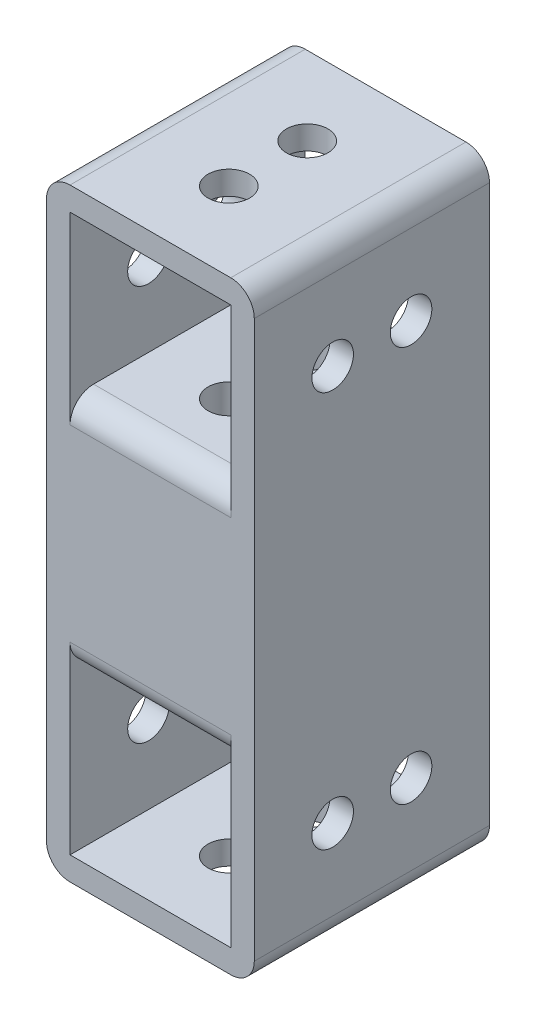
ISO-10303-21;
HEADER;
FILE_DESCRIPTION(('STEP AP214'),'2;1');
FILE_NAME('part.step','',(''),(''),'','','');
FILE_SCHEMA(('AUTOMOTIVE_DESIGN { 1 0 10303 214 1 1 1 1 }'));
ENDSEC;
DATA;
#1=APPLICATION_CONTEXT('core data for automotive mechanical design processes');
#2=APPLICATION_PROTOCOL_DEFINITION('international standard','automotive_design',2000,#1);
#3=PRODUCT_CONTEXT('',#1,'mechanical');
#4=PRODUCT('Part','Part','',(#3));
#5=PRODUCT_RELATED_PRODUCT_CATEGORY('part','',(#4));
#6=PRODUCT_DEFINITION_FORMATION('','',#4);
#7=PRODUCT_DEFINITION_CONTEXT('part definition',#1,'design');
#8=PRODUCT_DEFINITION('design','',#6,#7);
#9=PRODUCT_DEFINITION_SHAPE('','',#8);
#10=(LENGTH_UNIT() NAMED_UNIT(*) SI_UNIT(.MILLI.,.METRE.));
#11=(NAMED_UNIT(*) PLANE_ANGLE_UNIT() SI_UNIT($,.RADIAN.));
#12=(NAMED_UNIT(*) SI_UNIT($,.STERADIAN.) SOLID_ANGLE_UNIT());
#13=UNCERTAINTY_MEASURE_WITH_UNIT(LENGTH_MEASURE(1.E-05),#10,'distance_accuracy_value','');
#14=(GEOMETRIC_REPRESENTATION_CONTEXT(3) GLOBAL_UNCERTAINTY_ASSIGNED_CONTEXT((#13)) GLOBAL_UNIT_ASSIGNED_CONTEXT((#10,
#11,#12)) REPRESENTATION_CONTEXT('',''));
#15=CARTESIAN_POINT('',(0.,0.,0.));
#16=DIRECTION('',(0.,0.,1.));
#17=DIRECTION('',(1.,0.,0.));
#18=AXIS2_PLACEMENT_3D('',#15,#16,#17);
#19=CARTESIAN_POINT('',(-13.25,0.,30.));
#20=DIRECTION('',(-1.,0.,0.));
#21=DIRECTION('',(0.,0.,1.));
#22=AXIS2_PLACEMENT_3D('',#19,#20,#21);
#23=PLANE('',#22);
#24=CARTESIAN_POINT('',(-13.25,50.5,10.));
#25=DIRECTION('',(-1.,0.,0.));
#26=DIRECTION('',(0.,0.,1.));
#27=AXIS2_PLACEMENT_3D('',#24,#25,#26);
#28=CIRCLE('',#27,2.65);
#29=CARTESIAN_POINT('',(-13.25,50.5,12.65));
#30=VERTEX_POINT('',#29);
#31=EDGE_CURVE('E526',#30,#30,#28,.T.);
#32=ORIENTED_EDGE('',*,*,#31,.F.);
#33=EDGE_LOOP('',(#32));
#34=FACE_BOUND('',#33,.T.);
#35=CARTESIAN_POINT('',(-13.25,50.5,20.));
#36=DIRECTION('',(1.,0.,0.));
#37=DIRECTION('',(0.,0.,-1.));
#38=AXIS2_PLACEMENT_3D('',#35,#36,#37);
#39=CIRCLE('',#38,2.65);
#40=CARTESIAN_POINT('',(-13.25,50.5,17.35));
#41=VERTEX_POINT('',#40);
#42=EDGE_CURVE('E356',#41,#41,#39,.F.);
#43=ORIENTED_EDGE('',*,*,#42,.F.);
#44=EDGE_LOOP('',(#43));
#45=FACE_BOUND('',#44,.T.);
#46=DIRECTION('',(0.,1.,0.));
#47=VECTOR('',#46,1.);
#48=CARTESIAN_POINT('',(-13.25,0.,30.));
#49=LINE('',#48,#47);
#50=CARTESIAN_POINT('',(-13.25,-10.25,30.));
#51=VERTEX_POINT('',#50);
#52=CARTESIAN_POINT('',(-13.25,60.75,30.));
#53=VERTEX_POINT('',#52);
#54=EDGE_CURVE('E207',#51,#53,#49,.T.);
#55=ORIENTED_EDGE('',*,*,#54,.T.);
#56=DIRECTION('',(0.,0.,-1.));
#57=VECTOR('',#56,1.);
#58=CARTESIAN_POINT('',(-13.25,60.75,30.));
#59=LINE('',#58,#57);
#60=CARTESIAN_POINT('',(-13.25,60.75,0.));
#61=VERTEX_POINT('',#60);
#62=EDGE_CURVE('E289',#53,#61,#59,.T.);
#63=ORIENTED_EDGE('',*,*,#62,.T.);
#64=DIRECTION('',(0.,1.,0.));
#65=VECTOR('',#64,1.);
#66=CARTESIAN_POINT('',(-13.25,0.,0.));
#67=LINE('',#66,#65);
#68=CARTESIAN_POINT('',(-13.25,-10.25,0.));
#69=VERTEX_POINT('',#68);
#70=EDGE_CURVE('E243',#69,#61,#67,.T.);
#71=ORIENTED_EDGE('',*,*,#70,.F.);
#72=DIRECTION('',(0.,0.,-1.));
#73=VECTOR('',#72,1.);
#74=CARTESIAN_POINT('',(-13.25,-10.25,30.));
#75=LINE('',#74,#73);
#76=EDGE_CURVE('E278',#69,#51,#75,.F.);
#77=ORIENTED_EDGE('',*,*,#76,.T.);
#78=EDGE_LOOP('',(#55,#63,#71,#77));
#79=FACE_BOUND('',#78,.T.);
#80=CARTESIAN_POINT('',(-13.25,0.,10.));
#81=DIRECTION('',(1.,0.,0.));
#82=DIRECTION('',(0.,0.,-1.));
#83=AXIS2_PLACEMENT_3D('',#80,#81,#82);
#84=CIRCLE('',#83,2.65);
#85=CARTESIAN_POINT('',(-13.25,0.,7.35));
#86=VERTEX_POINT('',#85);
#87=EDGE_CURVE('E510',#86,#86,#84,.T.);
#88=ORIENTED_EDGE('',*,*,#87,.T.);
#89=EDGE_LOOP('',(#88));
#90=FACE_BOUND('',#89,.T.);
#91=CARTESIAN_POINT('',(-13.25,0.,20.));
#92=DIRECTION('',(1.,0.,0.));
#93=DIRECTION('',(0.,0.,-1.));
#94=AXIS2_PLACEMENT_3D('',#91,#92,#93);
#95=CIRCLE('',#94,2.65);
#96=CARTESIAN_POINT('',(-13.25,0.,17.35));
#97=VERTEX_POINT('',#96);
#98=EDGE_CURVE('E518',#97,#97,#95,.T.);
#99=ORIENTED_EDGE('',*,*,#98,.T.);
#100=EDGE_LOOP('',(#99));
#101=FACE_BOUND('',#100,.T.);
#102=ADVANCED_FACE('F47',(#34,#45,#79,#90,#101),#23,.T.);
#103=CARTESIAN_POINT('',(13.25,0.,30.));
#104=DIRECTION('',(-1.,0.,0.));
#105=DIRECTION('',(0.,0.,1.));
#106=AXIS2_PLACEMENT_3D('',#103,#104,#105);
#107=PLANE('',#106);
#108=CARTESIAN_POINT('',(13.25,50.5,10.));
#109=DIRECTION('',(-1.,0.,0.));
#110=DIRECTION('',(0.,0.,1.));
#111=AXIS2_PLACEMENT_3D('',#108,#109,#110);
#112=CIRCLE('',#111,2.65);
#113=CARTESIAN_POINT('',(13.25,50.5,12.65));
#114=VERTEX_POINT('',#113);
#115=EDGE_CURVE('E522',#114,#114,#112,.T.);
#116=ORIENTED_EDGE('',*,*,#115,.T.);
#117=EDGE_LOOP('',(#116));
#118=FACE_BOUND('',#117,.T.);
#119=CARTESIAN_POINT('',(13.25,0.,10.));
#120=DIRECTION('',(1.,0.,0.));
#121=DIRECTION('',(0.,0.,-1.));
#122=AXIS2_PLACEMENT_3D('',#119,#120,#121);
#123=CIRCLE('',#122,2.65);
#124=CARTESIAN_POINT('',(13.25,0.,7.35));
#125=VERTEX_POINT('',#124);
#126=EDGE_CURVE('E506',#125,#125,#123,.T.);
#127=ORIENTED_EDGE('',*,*,#126,.F.);
#128=EDGE_LOOP('',(#127));
#129=FACE_BOUND('',#128,.T.);
#130=CARTESIAN_POINT('',(13.25,50.5,20.));
#131=DIRECTION('',(1.,0.,0.));
#132=DIRECTION('',(0.,0.,-1.));
#133=AXIS2_PLACEMENT_3D('',#130,#131,#132);
#134=CIRCLE('',#133,2.65);
#135=CARTESIAN_POINT('',(13.25,50.5,17.35));
#136=VERTEX_POINT('',#135);
#137=EDGE_CURVE('E502',#136,#136,#134,.F.);
#138=ORIENTED_EDGE('',*,*,#137,.T.);
#139=EDGE_LOOP('',(#138));
#140=FACE_BOUND('',#139,.T.);
#141=DIRECTION('',(0.,1.,0.));
#142=VECTOR('',#141,1.);
#143=CARTESIAN_POINT('',(13.25,0.,0.));
#144=LINE('',#143,#142);
#145=CARTESIAN_POINT('',(13.25,-10.25,0.));
#146=VERTEX_POINT('',#145);
#147=CARTESIAN_POINT('',(13.25,60.75,0.));
#148=VERTEX_POINT('',#147);
#149=EDGE_CURVE('E251',#146,#148,#144,.T.);
#150=ORIENTED_EDGE('',*,*,#149,.T.);
#151=DIRECTION('',(0.,0.,-1.));
#152=VECTOR('',#151,1.);
#153=CARTESIAN_POINT('',(13.25,60.75,30.));
#154=LINE('',#153,#152);
#155=CARTESIAN_POINT('',(13.25,60.75,30.));
#156=VERTEX_POINT('',#155);
#157=EDGE_CURVE('E328',#148,#156,#154,.F.);
#158=ORIENTED_EDGE('',*,*,#157,.T.);
#159=DIRECTION('',(0.,1.,0.));
#160=VECTOR('',#159,1.);
#161=CARTESIAN_POINT('',(13.25,0.,30.));
#162=LINE('',#161,#160);
#163=CARTESIAN_POINT('',(13.25,-10.25,30.));
#164=VERTEX_POINT('',#163);
#165=EDGE_CURVE('E218',#164,#156,#162,.T.);
#166=ORIENTED_EDGE('',*,*,#165,.F.);
#167=DIRECTION('',(0.,0.,-1.));
#168=VECTOR('',#167,1.);
#169=CARTESIAN_POINT('',(13.25,-10.25,30.));
#170=LINE('',#169,#168);
#171=EDGE_CURVE('E324',#164,#146,#170,.T.);
#172=ORIENTED_EDGE('',*,*,#171,.T.);
#173=EDGE_LOOP('',(#150,#158,#166,#172));
#174=FACE_BOUND('',#173,.T.);
#175=CARTESIAN_POINT('',(13.25,0.,20.));
#176=DIRECTION('',(1.,0.,0.));
#177=DIRECTION('',(0.,0.,-1.));
#178=AXIS2_PLACEMENT_3D('',#175,#176,#177);
#179=CIRCLE('',#178,2.65);
#180=CARTESIAN_POINT('',(13.25,0.,17.35));
#181=VERTEX_POINT('',#180);
#182=EDGE_CURVE('E514',#181,#181,#179,.T.);
#183=ORIENTED_EDGE('',*,*,#182,.F.);
#184=EDGE_LOOP('',(#183));
#185=FACE_BOUND('',#184,.T.);
#186=ADVANCED_FACE('F537',(#118,#129,#140,#174,#185),#107,.F.);
#187=CARTESIAN_POINT('',(10.25,0.,30.));
#188=DIRECTION('',(-1.,0.,0.));
#189=DIRECTION('',(0.,0.,1.));
#190=AXIS2_PLACEMENT_3D('',#187,#188,#189);
#191=PLANE('',#190);
#192=CARTESIAN_POINT('',(10.25,0.,20.));
#193=DIRECTION('',(-1.,0.,0.));
#194=DIRECTION('',(0.,0.,1.));
#195=AXIS2_PLACEMENT_3D('',#192,#193,#194);
#196=CIRCLE('',#195,2.65);
#197=CARTESIAN_POINT('',(10.25,0.,22.65));
#198=VERTEX_POINT('',#197);
#199=EDGE_CURVE('E477',#198,#198,#196,.T.);
#200=ORIENTED_EDGE('',*,*,#199,.F.);
#201=EDGE_LOOP('',(#200));
#202=FACE_BOUND('',#201,.T.);
#203=CARTESIAN_POINT('',(10.25,0.,10.));
#204=DIRECTION('',(-1.,0.,0.));
#205=DIRECTION('',(0.,0.,1.));
#206=AXIS2_PLACEMENT_3D('',#203,#204,#205);
#207=CIRCLE('',#206,2.65);
#208=CARTESIAN_POINT('',(10.25,0.,12.65));
#209=VERTEX_POINT('',#208);
#210=EDGE_CURVE('E485',#209,#209,#207,.T.);
#211=ORIENTED_EDGE('',*,*,#210,.F.);
#212=EDGE_LOOP('',(#211));
#213=FACE_BOUND('',#212,.T.);
#214=DIRECTION('',(0.,1.,0.));
#215=VECTOR('',#214,1.);
#216=CARTESIAN_POINT('',(10.25,0.,0.));
#217=LINE('',#216,#215);
#218=CARTESIAN_POINT('',(10.25,-10.25,0.));
#219=VERTEX_POINT('',#218);
#220=CARTESIAN_POINT('',(10.25,13.25,0.));
#221=VERTEX_POINT('',#220);
#222=EDGE_CURVE('E236',#219,#221,#217,.T.);
#223=ORIENTED_EDGE('',*,*,#222,.F.);
#224=DIRECTION('',(0.,0.,-1.));
#225=VECTOR('',#224,1.);
#226=CARTESIAN_POINT('',(10.25,-10.25,30.));
#227=LINE('',#226,#225);
#228=CARTESIAN_POINT('',(10.25,-10.25,30.));
#229=VERTEX_POINT('',#228);
#230=EDGE_CURVE('E275',#229,#219,#227,.T.);
#231=ORIENTED_EDGE('',*,*,#230,.F.);
#232=DIRECTION('',(0.,1.,0.));
#233=VECTOR('',#232,1.);
#234=CARTESIAN_POINT('',(10.25,0.,30.));
#235=LINE('',#234,#233);
#236=CARTESIAN_POINT('',(10.25,13.25,30.));
#237=VERTEX_POINT('',#236);
#238=EDGE_CURVE('E226',#229,#237,#235,.T.);
#239=ORIENTED_EDGE('',*,*,#238,.T.);
#240=CARTESIAN_POINT('',(10.25,13.25,27.));
#241=DIRECTION('',(-1.,0.,0.));
#242=DIRECTION('',(0.,0.,1.));
#243=AXIS2_PLACEMENT_3D('',#240,#241,#242);
#244=CIRCLE('',#243,3.);
#245=CARTESIAN_POINT('',(10.25,10.25,27.));
#246=VERTEX_POINT('',#245);
#247=EDGE_CURVE('E56',#237,#246,#244,.F.);
#248=ORIENTED_EDGE('',*,*,#247,.T.);
#249=DIRECTION('',(0.,0.,-1.));
#250=VECTOR('',#249,1.);
#251=CARTESIAN_POINT('',(10.25,10.25,30.));
#252=LINE('',#251,#250);
#253=CARTESIAN_POINT('',(10.25,10.25,3.));
#254=VERTEX_POINT('',#253);
#255=EDGE_CURVE('E263',#246,#254,#252,.T.);
#256=ORIENTED_EDGE('',*,*,#255,.T.);
#257=CARTESIAN_POINT('',(10.25,13.25,3.));
#258=DIRECTION('',(-1.,0.,0.));
#259=DIRECTION('',(0.,0.,1.));
#260=AXIS2_PLACEMENT_3D('',#257,#258,#259);
#261=CIRCLE('',#260,3.);
#262=EDGE_CURVE('E395',#254,#221,#261,.F.);
#263=ORIENTED_EDGE('',*,*,#262,.T.);
#264=EDGE_LOOP('',(#223,#231,#239,#248,#256,#263));
#265=FACE_BOUND('',#264,.T.);
#266=ADVANCED_FACE('F412',(#202,#213,#265),#191,.T.);
#267=CARTESIAN_POINT('',(0.,-10.25,30.));
#268=DIRECTION('',(0.,1.,0.));
#269=DIRECTION('',(0.,0.,1.));
#270=AXIS2_PLACEMENT_3D('',#267,#268,#269);
#271=PLANE('',#270);
#272=CARTESIAN_POINT('',(0.,-10.25,10.));
#273=DIRECTION('',(0.,1.,0.));
#274=DIRECTION('',(0.,0.,1.));
#275=AXIS2_PLACEMENT_3D('',#272,#273,#274);
#276=CIRCLE('',#275,2.65);
#277=CARTESIAN_POINT('',(0.,-10.25,12.65));
#278=VERTEX_POINT('',#277);
#279=EDGE_CURVE('E235',#278,#278,#276,.T.);
#280=ORIENTED_EDGE('',*,*,#279,.F.);
#281=EDGE_LOOP('',(#280));
#282=FACE_BOUND('',#281,.T.);
#283=CARTESIAN_POINT('',(0.,-10.25,20.));
#284=DIRECTION('',(0.,1.,0.));
#285=DIRECTION('',(0.,0.,1.));
#286=AXIS2_PLACEMENT_3D('',#283,#284,#285);
#287=CIRCLE('',#286,2.65);
#288=CARTESIAN_POINT('',(0.,-10.25,22.65));
#289=VERTEX_POINT('',#288);
#290=EDGE_CURVE('E350',#289,#289,#287,.T.);
#291=ORIENTED_EDGE('',*,*,#290,.F.);
#292=EDGE_LOOP('',(#291));
#293=FACE_BOUND('',#292,.T.);
#294=DIRECTION('',(1.,0.,0.));
#295=VECTOR('',#294,1.);
#296=CARTESIAN_POINT('',(0.,-10.25,0.));
#297=LINE('',#296,#295);
#298=CARTESIAN_POINT('',(-10.25,-10.25,0.));
#299=VERTEX_POINT('',#298);
#300=EDGE_CURVE('E259',#299,#219,#297,.T.);
#301=ORIENTED_EDGE('',*,*,#300,.F.);
#302=DIRECTION('',(0.,0.,-1.));
#303=VECTOR('',#302,1.);
#304=CARTESIAN_POINT('',(-10.25,-10.25,30.));
#305=LINE('',#304,#303);
#306=CARTESIAN_POINT('',(-10.25,-10.25,30.));
#307=VERTEX_POINT('',#306);
#308=EDGE_CURVE('E272',#307,#299,#305,.T.);
#309=ORIENTED_EDGE('',*,*,#308,.F.);
#310=DIRECTION('',(1.,0.,0.));
#311=VECTOR('',#310,1.);
#312=CARTESIAN_POINT('',(0.,-10.25,30.));
#313=LINE('',#312,#311);
#314=EDGE_CURVE('E227',#307,#229,#313,.T.);
#315=ORIENTED_EDGE('',*,*,#314,.T.);
#316=ORIENTED_EDGE('',*,*,#230,.T.);
#317=EDGE_LOOP('',(#301,#309,#315,#316));
#318=FACE_BOUND('',#317,.T.);
#319=ADVANCED_FACE('F436',(#282,#293,#318),#271,.T.);
#320=CARTESIAN_POINT('',(-10.25,0.,30.));
#321=DIRECTION('',(-1.,0.,0.));
#322=DIRECTION('',(0.,0.,1.));
#323=AXIS2_PLACEMENT_3D('',#320,#321,#322);
#324=PLANE('',#323);
#325=CARTESIAN_POINT('',(-10.25,0.,20.));
#326=DIRECTION('',(-1.,0.,0.));
#327=DIRECTION('',(0.,0.,1.));
#328=AXIS2_PLACEMENT_3D('',#325,#326,#327);
#329=CIRCLE('',#328,2.65);
#330=CARTESIAN_POINT('',(-10.25,0.,22.65));
#331=VERTEX_POINT('',#330);
#332=EDGE_CURVE('E481',#331,#331,#329,.T.);
#333=ORIENTED_EDGE('',*,*,#332,.T.);
#334=EDGE_LOOP('',(#333));
#335=FACE_BOUND('',#334,.T.);
#336=CARTESIAN_POINT('',(-10.25,0.,10.));
#337=DIRECTION('',(-1.,0.,0.));
#338=DIRECTION('',(0.,0.,1.));
#339=AXIS2_PLACEMENT_3D('',#336,#337,#338);
#340=CIRCLE('',#339,2.65);
#341=CARTESIAN_POINT('',(-10.25,0.,12.65));
#342=VERTEX_POINT('',#341);
#343=EDGE_CURVE('E489',#342,#342,#340,.T.);
#344=ORIENTED_EDGE('',*,*,#343,.T.);
#345=EDGE_LOOP('',(#344));
#346=FACE_BOUND('',#345,.T.);
#347=DIRECTION('',(0.,1.,0.));
#348=VECTOR('',#347,1.);
#349=CARTESIAN_POINT('',(-10.25,0.,0.));
#350=LINE('',#349,#348);
#351=CARTESIAN_POINT('',(-10.25,13.25,0.));
#352=VERTEX_POINT('',#351);
#353=EDGE_CURVE('E240',#299,#352,#350,.T.);
#354=ORIENTED_EDGE('',*,*,#353,.T.);
#355=CARTESIAN_POINT('',(-10.25,13.25,3.));
#356=DIRECTION('',(-1.,0.,0.));
#357=DIRECTION('',(0.,0.,1.));
#358=AXIS2_PLACEMENT_3D('',#355,#356,#357);
#359=CIRCLE('',#358,3.);
#360=CARTESIAN_POINT('',(-10.25,10.25,3.));
#361=VERTEX_POINT('',#360);
#362=EDGE_CURVE('E399',#352,#361,#359,.T.);
#363=ORIENTED_EDGE('',*,*,#362,.T.);
#364=DIRECTION('',(0.,0.,-1.));
#365=VECTOR('',#364,1.);
#366=CARTESIAN_POINT('',(-10.25,10.25,30.));
#367=LINE('',#366,#365);
#368=CARTESIAN_POINT('',(-10.25,10.25,27.));
#369=VERTEX_POINT('',#368);
#370=EDGE_CURVE('E267',#369,#361,#367,.T.);
#371=ORIENTED_EDGE('',*,*,#370,.F.);
#372=CARTESIAN_POINT('',(-10.25,13.25,27.));
#373=DIRECTION('',(-1.,0.,0.));
#374=DIRECTION('',(0.,0.,1.));
#375=AXIS2_PLACEMENT_3D('',#372,#373,#374);
#376=CIRCLE('',#375,3.);
#377=CARTESIAN_POINT('',(-10.25,13.25,30.));
#378=VERTEX_POINT('',#377);
#379=EDGE_CURVE('E11',#369,#378,#376,.T.);
#380=ORIENTED_EDGE('',*,*,#379,.T.);
#381=DIRECTION('',(0.,1.,0.));
#382=VECTOR('',#381,1.);
#383=CARTESIAN_POINT('',(-10.25,0.,30.));
#384=LINE('',#383,#382);
#385=EDGE_CURVE('E192',#307,#378,#384,.T.);
#386=ORIENTED_EDGE('',*,*,#385,.F.);
#387=ORIENTED_EDGE('',*,*,#308,.T.);
#388=EDGE_LOOP('',(#354,#363,#371,#380,#386,#387));
#389=FACE_BOUND('',#388,.T.);
#390=ADVANCED_FACE('F424',(#335,#346,#389),#324,.F.);
#391=CARTESIAN_POINT('',(0.,-13.25,30.));
#392=DIRECTION('',(0.,1.,0.));
#393=DIRECTION('',(0.,0.,1.));
#394=AXIS2_PLACEMENT_3D('',#391,#392,#393);
#395=PLANE('',#394);
#396=CARTESIAN_POINT('',(0.,-13.25,10.));
#397=DIRECTION('',(0.,1.,0.));
#398=DIRECTION('',(0.,0.,1.));
#399=AXIS2_PLACEMENT_3D('',#396,#397,#398);
#400=CIRCLE('',#399,2.65);
#401=CARTESIAN_POINT('',(0.,-13.25,12.65));
#402=VERTEX_POINT('',#401);
#403=EDGE_CURVE('E344',#402,#402,#400,.T.);
#404=ORIENTED_EDGE('',*,*,#403,.T.);
#405=EDGE_LOOP('',(#404));
#406=FACE_BOUND('',#405,.T.);
#407=CARTESIAN_POINT('',(0.,-13.25,20.));
#408=DIRECTION('',(0.,1.,0.));
#409=DIRECTION('',(0.,0.,1.));
#410=AXIS2_PLACEMENT_3D('',#407,#408,#409);
#411=CIRCLE('',#410,2.65);
#412=CARTESIAN_POINT('',(0.,-13.25,22.65));
#413=VERTEX_POINT('',#412);
#414=EDGE_CURVE('E473',#413,#413,#411,.T.);
#415=ORIENTED_EDGE('',*,*,#414,.T.);
#416=EDGE_LOOP('',(#415));
#417=FACE_BOUND('',#416,.T.);
#418=DIRECTION('',(1.,0.,0.));
#419=VECTOR('',#418,1.);
#420=CARTESIAN_POINT('',(0.,-13.25,0.));
#421=LINE('',#420,#419);
#422=CARTESIAN_POINT('',(-10.25,-13.25,0.));
#423=VERTEX_POINT('',#422);
#424=CARTESIAN_POINT('',(10.25,-13.25,0.));
#425=VERTEX_POINT('',#424);
#426=EDGE_CURVE('E247',#423,#425,#421,.T.);
#427=ORIENTED_EDGE('',*,*,#426,.T.);
#428=DIRECTION('',(0.,0.,-1.));
#429=VECTOR('',#428,1.);
#430=CARTESIAN_POINT('',(10.25,-13.25,30.));
#431=LINE('',#430,#429);
#432=CARTESIAN_POINT('',(10.25,-13.25,30.));
#433=VERTEX_POINT('',#432);
#434=EDGE_CURVE('E335',#425,#433,#431,.F.);
#435=ORIENTED_EDGE('',*,*,#434,.T.);
#436=DIRECTION('',(1.,0.,0.));
#437=VECTOR('',#436,1.);
#438=CARTESIAN_POINT('',(0.,-13.25,30.));
#439=LINE('',#438,#437);
#440=CARTESIAN_POINT('',(-10.25,-13.25,30.));
#441=VERTEX_POINT('',#440);
#442=EDGE_CURVE('E211',#441,#433,#439,.T.);
#443=ORIENTED_EDGE('',*,*,#442,.F.);
#444=DIRECTION('',(0.,0.,-1.));
#445=VECTOR('',#444,1.);
#446=CARTESIAN_POINT('',(-10.25,-13.25,0.));
#447=LINE('',#446,#445);
#448=EDGE_CURVE('E331',#441,#423,#447,.T.);
#449=ORIENTED_EDGE('',*,*,#448,.T.);
#450=EDGE_LOOP('',(#427,#435,#443,#449));
#451=FACE_BOUND('',#450,.T.);
#452=ADVANCED_FACE('F559',(#406,#417,#451),#395,.F.);
#453=CARTESIAN_POINT('',(10.25,50.5,10.));
#454=DIRECTION('',(-1.,0.,0.));
#455=DIRECTION('',(0.,0.,1.));
#456=AXIS2_PLACEMENT_3D('',#453,#454,#455);
#457=CIRCLE('',#456,2.65);
#458=CARTESIAN_POINT('',(10.25,50.5,12.65));
#459=VERTEX_POINT('',#458);
#460=EDGE_CURVE('E361',#459,#459,#457,.F.);
#461=ORIENTED_EDGE('',*,*,#460,.T.);
#462=EDGE_LOOP('',(#461));
#463=FACE_BOUND('',#462,.T.);
#464=CARTESIAN_POINT('',(10.25,50.5,20.));
#465=DIRECTION('',(-1.,0.,0.));
#466=DIRECTION('',(0.,0.,1.));
#467=AXIS2_PLACEMENT_3D('',#464,#465,#466);
#468=CIRCLE('',#467,2.65);
#469=CARTESIAN_POINT('',(10.25,50.5,22.65));
#470=VERTEX_POINT('',#469);
#471=EDGE_CURVE('E355',#470,#470,#468,.F.);
#472=ORIENTED_EDGE('',*,*,#471,.T.);
#473=EDGE_LOOP('',(#472));
#474=FACE_BOUND('',#473,.T.);
#475=CARTESIAN_POINT('',(10.25,37.25,0.));
#476=VERTEX_POINT('',#475);
#477=CARTESIAN_POINT('',(10.25,60.75,0.));
#478=VERTEX_POINT('',#477);
#479=EDGE_CURVE('E231',#476,#478,#217,.T.);
#480=ORIENTED_EDGE('',*,*,#479,.F.);
#481=CARTESIAN_POINT('',(10.25,37.25,3.));
#482=DIRECTION('',(-1.,0.,0.));
#483=DIRECTION('',(0.,0.,1.));
#484=AXIS2_PLACEMENT_3D('',#481,#482,#483);
#485=CIRCLE('',#484,3.);
#486=CARTESIAN_POINT('',(10.25,40.25,3.));
#487=VERTEX_POINT('',#486);
#488=EDGE_CURVE('E389',#476,#487,#485,.F.);
#489=ORIENTED_EDGE('',*,*,#488,.T.);
#490=DIRECTION('',(0.,0.,-1.));
#491=VECTOR('',#490,1.);
#492=CARTESIAN_POINT('',(10.25,40.25,30.));
#493=LINE('',#492,#491);
#494=CARTESIAN_POINT('',(10.25,40.25,27.));
#495=VERTEX_POINT('',#494);
#496=EDGE_CURVE('E268',#495,#487,#493,.T.);
#497=ORIENTED_EDGE('',*,*,#496,.F.);
#498=CARTESIAN_POINT('',(10.25,37.25,27.));
#499=DIRECTION('',(-1.,0.,0.));
#500=DIRECTION('',(0.,0.,1.));
#501=AXIS2_PLACEMENT_3D('',#498,#499,#500);
#502=CIRCLE('',#501,3.);
#503=CARTESIAN_POINT('',(10.25,37.25,30.));
#504=VERTEX_POINT('',#503);
#505=EDGE_CURVE('E402',#495,#504,#502,.F.);
#506=ORIENTED_EDGE('',*,*,#505,.T.);
#507=CARTESIAN_POINT('',(10.25,60.75,30.));
#508=VERTEX_POINT('',#507);
#509=EDGE_CURVE('E63',#504,#508,#235,.T.);
#510=ORIENTED_EDGE('',*,*,#509,.T.);
#511=DIRECTION('',(0.,0.,-1.));
#512=VECTOR('',#511,1.);
#513=CARTESIAN_POINT('',(10.25,60.75,30.));
#514=LINE('',#513,#512);
#515=EDGE_CURVE('E203',#508,#478,#514,.T.);
#516=ORIENTED_EDGE('',*,*,#515,.T.);
#517=EDGE_LOOP('',(#480,#489,#497,#506,#510,#516));
#518=FACE_BOUND('',#517,.T.);
#519=ADVANCED_FACE('F654',(#463,#474,#518),#191,.T.);
#520=CARTESIAN_POINT('',(0.,40.25,30.));
#521=DIRECTION('',(0.,1.,0.));
#522=DIRECTION('',(0.,0.,1.));
#523=AXIS2_PLACEMENT_3D('',#520,#521,#522);
#524=PLANE('',#523);
#525=CARTESIAN_POINT('',(0.,40.25,10.));
#526=DIRECTION('',(0.,1.,0.));
#527=DIRECTION('',(0.,0.,1.));
#528=AXIS2_PLACEMENT_3D('',#525,#526,#527);
#529=CIRCLE('',#528,2.65);
#530=CARTESIAN_POINT('',(0.,40.25,12.65));
#531=VERTEX_POINT('',#530);
#532=EDGE_CURVE('E446',#531,#531,#529,.T.);
#533=ORIENTED_EDGE('',*,*,#532,.F.);
#534=EDGE_LOOP('',(#533));
#535=FACE_BOUND('',#534,.T.);
#536=CARTESIAN_POINT('',(0.,40.25,20.));
#537=DIRECTION('',(0.,1.,0.));
#538=DIRECTION('',(0.,0.,1.));
#539=AXIS2_PLACEMENT_3D('',#536,#537,#538);
#540=CIRCLE('',#539,2.65);
#541=CARTESIAN_POINT('',(0.,40.25,22.65));
#542=VERTEX_POINT('',#541);
#543=EDGE_CURVE('E455',#542,#542,#540,.T.);
#544=ORIENTED_EDGE('',*,*,#543,.F.);
#545=EDGE_LOOP('',(#544));
#546=FACE_BOUND('',#545,.T.);
#547=ORIENTED_EDGE('',*,*,#496,.T.);
#548=DIRECTION('',(1.,0.,0.));
#549=VECTOR('',#548,1.);
#550=CARTESIAN_POINT('',(-10.25,40.25,3.));
#551=LINE('',#550,#549);
#552=CARTESIAN_POINT('',(-10.25,40.25,3.));
#553=VERTEX_POINT('',#552);
#554=EDGE_CURVE('E373',#487,#553,#551,.F.);
#555=ORIENTED_EDGE('',*,*,#554,.T.);
#556=DIRECTION('',(0.,0.,-1.));
#557=VECTOR('',#556,1.);
#558=CARTESIAN_POINT('',(-10.25,40.25,30.));
#559=LINE('',#558,#557);
#560=CARTESIAN_POINT('',(-10.25,40.25,27.));
#561=VERTEX_POINT('',#560);
#562=EDGE_CURVE('E202',#561,#553,#559,.T.);
#563=ORIENTED_EDGE('',*,*,#562,.F.);
#564=DIRECTION('',(1.,0.,0.));
#565=VECTOR('',#564,1.);
#566=CARTESIAN_POINT('',(0.,40.25,27.));
#567=LINE('',#566,#565);
#568=EDGE_CURVE('E369',#561,#495,#567,.T.);
#569=ORIENTED_EDGE('',*,*,#568,.T.);
#570=EDGE_LOOP('',(#547,#555,#563,#569));
#571=FACE_BOUND('',#570,.T.);
#572=ADVANCED_FACE('F648',(#535,#546,#571),#524,.T.);
#573=CARTESIAN_POINT('',(-10.25,50.5,10.));
#574=DIRECTION('',(-1.,0.,0.));
#575=DIRECTION('',(0.,0.,1.));
#576=AXIS2_PLACEMENT_3D('',#573,#574,#575);
#577=CIRCLE('',#576,2.65);
#578=CARTESIAN_POINT('',(-10.25,50.5,12.65));
#579=VERTEX_POINT('',#578);
#580=EDGE_CURVE('E357',#579,#579,#577,.F.);
#581=ORIENTED_EDGE('',*,*,#580,.F.);
#582=EDGE_LOOP('',(#581));
#583=FACE_BOUND('',#582,.T.);
#584=CARTESIAN_POINT('',(-10.25,50.5,20.));
#585=DIRECTION('',(-1.,0.,0.));
#586=DIRECTION('',(0.,0.,1.));
#587=AXIS2_PLACEMENT_3D('',#584,#585,#586);
#588=CIRCLE('',#587,2.65);
#589=CARTESIAN_POINT('',(-10.25,50.5,22.65));
#590=VERTEX_POINT('',#589);
#591=EDGE_CURVE('E351',#590,#590,#588,.F.);
#592=ORIENTED_EDGE('',*,*,#591,.F.);
#593=EDGE_LOOP('',(#592));
#594=FACE_BOUND('',#593,.T.);
#595=CARTESIAN_POINT('',(-10.25,37.25,0.));
#596=VERTEX_POINT('',#595);
#597=CARTESIAN_POINT('',(-10.25,60.75,0.));
#598=VERTEX_POINT('',#597);
#599=EDGE_CURVE('E197',#596,#598,#350,.T.);
#600=ORIENTED_EDGE('',*,*,#599,.T.);
#601=DIRECTION('',(0.,0.,-1.));
#602=VECTOR('',#601,1.);
#603=CARTESIAN_POINT('',(-10.25,60.75,30.));
#604=LINE('',#603,#602);
#605=CARTESIAN_POINT('',(-10.25,60.75,30.));
#606=VERTEX_POINT('',#605);
#607=EDGE_CURVE('E194',#606,#598,#604,.T.);
#608=ORIENTED_EDGE('',*,*,#607,.F.);
#609=CARTESIAN_POINT('',(-10.25,37.25,30.));
#610=VERTEX_POINT('',#609);
#611=EDGE_CURVE('E71',#610,#606,#384,.T.);
#612=ORIENTED_EDGE('',*,*,#611,.F.);
#613=CARTESIAN_POINT('',(-10.25,37.25,27.));
#614=DIRECTION('',(-1.,0.,0.));
#615=DIRECTION('',(0.,0.,1.));
#616=AXIS2_PLACEMENT_3D('',#613,#614,#615);
#617=CIRCLE('',#616,3.);
#618=EDGE_CURVE('E405',#610,#561,#617,.T.);
#619=ORIENTED_EDGE('',*,*,#618,.T.);
#620=ORIENTED_EDGE('',*,*,#562,.T.);
#621=CARTESIAN_POINT('',(-10.25,37.25,3.));
#622=DIRECTION('',(-1.,0.,0.));
#623=DIRECTION('',(0.,0.,1.));
#624=AXIS2_PLACEMENT_3D('',#621,#622,#623);
#625=CIRCLE('',#624,3.);
#626=EDGE_CURVE('E392',#553,#596,#625,.T.);
#627=ORIENTED_EDGE('',*,*,#626,.T.);
#628=EDGE_LOOP('',(#600,#608,#612,#619,#620,#627));
#629=FACE_BOUND('',#628,.T.);
#630=ADVANCED_FACE('F195',(#583,#594,#629),#324,.F.);
#631=CARTESIAN_POINT('',(0.,63.75,30.));
#632=DIRECTION('',(0.,1.,0.));
#633=DIRECTION('',(0.,0.,1.));
#634=AXIS2_PLACEMENT_3D('',#631,#632,#633);
#635=PLANE('',#634);
#636=CARTESIAN_POINT('',(0.,63.75,10.));
#637=DIRECTION('',(0.,1.,0.));
#638=DIRECTION('',(0.,0.,1.));
#639=AXIS2_PLACEMENT_3D('',#636,#637,#638);
#640=CIRCLE('',#639,2.65);
#641=CARTESIAN_POINT('',(0.,63.75,12.65));
#642=VERTEX_POINT('',#641);
#643=EDGE_CURVE('E465',#642,#642,#640,.T.);
#644=ORIENTED_EDGE('',*,*,#643,.F.);
#645=EDGE_LOOP('',(#644));
#646=FACE_BOUND('',#645,.T.);
#647=CARTESIAN_POINT('',(0.,63.75,20.));
#648=DIRECTION('',(0.,1.,0.));
#649=DIRECTION('',(0.,0.,1.));
#650=AXIS2_PLACEMENT_3D('',#647,#648,#649);
#651=CIRCLE('',#650,2.65);
#652=CARTESIAN_POINT('',(0.,63.75,22.65));
#653=VERTEX_POINT('',#652);
#654=EDGE_CURVE('E469',#653,#653,#651,.T.);
#655=ORIENTED_EDGE('',*,*,#654,.F.);
#656=EDGE_LOOP('',(#655));
#657=FACE_BOUND('',#656,.T.);
#658=DIRECTION('',(1.,0.,0.));
#659=VECTOR('',#658,1.);
#660=CARTESIAN_POINT('',(0.,63.75,0.));
#661=LINE('',#660,#659);
#662=CARTESIAN_POINT('',(-10.25,63.75,0.));
#663=VERTEX_POINT('',#662);
#664=CARTESIAN_POINT('',(10.25,63.75,0.));
#665=VERTEX_POINT('',#664);
#666=EDGE_CURVE('E255',#663,#665,#661,.T.);
#667=ORIENTED_EDGE('',*,*,#666,.F.);
#668=DIRECTION('',(0.,0.,-1.));
#669=VECTOR('',#668,1.);
#670=CARTESIAN_POINT('',(-10.25,63.75,30.));
#671=LINE('',#670,#669);
#672=CARTESIAN_POINT('',(-10.25,63.75,30.));
#673=VERTEX_POINT('',#672);
#674=EDGE_CURVE('E309',#663,#673,#671,.F.);
#675=ORIENTED_EDGE('',*,*,#674,.T.);
#676=DIRECTION('',(1.,0.,0.));
#677=VECTOR('',#676,1.);
#678=CARTESIAN_POINT('',(0.,63.75,30.));
#679=LINE('',#678,#677);
#680=CARTESIAN_POINT('',(10.25,63.75,30.));
#681=VERTEX_POINT('',#680);
#682=EDGE_CURVE('E222',#673,#681,#679,.T.);
#683=ORIENTED_EDGE('',*,*,#682,.T.);
#684=DIRECTION('',(0.,0.,-1.));
#685=VECTOR('',#684,1.);
#686=CARTESIAN_POINT('',(10.25,63.75,0.));
#687=LINE('',#686,#685);
#688=EDGE_CURVE('E305',#681,#665,#687,.T.);
#689=ORIENTED_EDGE('',*,*,#688,.T.);
#690=EDGE_LOOP('',(#667,#675,#683,#689));
#691=FACE_BOUND('',#690,.T.);
#692=ADVANCED_FACE('F606',(#646,#657,#691),#635,.T.);
#693=CARTESIAN_POINT('',(0.,60.75,30.));
#694=DIRECTION('',(0.,1.,0.));
#695=DIRECTION('',(0.,0.,1.));
#696=AXIS2_PLACEMENT_3D('',#693,#694,#695);
#697=PLANE('',#696);
#698=CARTESIAN_POINT('',(0.,60.75,10.));
#699=DIRECTION('',(0.,1.,0.));
#700=DIRECTION('',(0.,0.,1.));
#701=AXIS2_PLACEMENT_3D('',#698,#699,#700);
#702=CIRCLE('',#701,2.65);
#703=CARTESIAN_POINT('',(0.,60.75,12.65));
#704=VERTEX_POINT('',#703);
#705=EDGE_CURVE('E349',#704,#704,#702,.T.);
#706=ORIENTED_EDGE('',*,*,#705,.T.);
#707=EDGE_LOOP('',(#706));
#708=FACE_BOUND('',#707,.T.);
#709=CARTESIAN_POINT('',(0.,60.75,20.));
#710=DIRECTION('',(0.,1.,0.));
#711=DIRECTION('',(0.,0.,1.));
#712=AXIS2_PLACEMENT_3D('',#709,#710,#711);
#713=CIRCLE('',#712,2.65);
#714=CARTESIAN_POINT('',(0.,60.75,22.65));
#715=VERTEX_POINT('',#714);
#716=EDGE_CURVE('E343',#715,#715,#713,.T.);
#717=ORIENTED_EDGE('',*,*,#716,.T.);
#718=EDGE_LOOP('',(#717));
#719=FACE_BOUND('',#718,.T.);
#720=DIRECTION('',(1.,0.,0.));
#721=VECTOR('',#720,1.);
#722=CARTESIAN_POINT('',(0.,60.75,0.));
#723=LINE('',#722,#721);
#724=EDGE_CURVE('E239',#598,#478,#723,.T.);
#725=ORIENTED_EDGE('',*,*,#724,.T.);
#726=ORIENTED_EDGE('',*,*,#515,.F.);
#727=DIRECTION('',(1.,0.,0.));
#728=VECTOR('',#727,1.);
#729=CARTESIAN_POINT('',(0.,60.75,30.));
#730=LINE('',#729,#728);
#731=EDGE_CURVE('E185',#606,#508,#730,.T.);
#732=ORIENTED_EDGE('',*,*,#731,.F.);
#733=ORIENTED_EDGE('',*,*,#607,.T.);
#734=EDGE_LOOP('',(#725,#726,#732,#733));
#735=FACE_BOUND('',#734,.T.);
#736=ADVANCED_FACE('F205',(#708,#719,#735),#697,.F.);
#737=CARTESIAN_POINT('',(0.,10.25,30.));
#738=DIRECTION('',(0.,1.,0.));
#739=DIRECTION('',(0.,0.,1.));
#740=AXIS2_PLACEMENT_3D('',#737,#738,#739);
#741=PLANE('',#740);
#742=CARTESIAN_POINT('',(0.,10.25,10.));
#743=DIRECTION('',(0.,1.,0.));
#744=DIRECTION('',(0.,0.,1.));
#745=AXIS2_PLACEMENT_3D('',#742,#743,#744);
#746=CIRCLE('',#745,2.65);
#747=CARTESIAN_POINT('',(0.,10.25,12.65));
#748=VERTEX_POINT('',#747);
#749=EDGE_CURVE('E345',#748,#748,#746,.T.);
#750=ORIENTED_EDGE('',*,*,#749,.T.);
#751=EDGE_LOOP('',(#750));
#752=FACE_BOUND('',#751,.T.);
#753=CARTESIAN_POINT('',(0.,10.25,20.));
#754=DIRECTION('',(0.,1.,0.));
#755=DIRECTION('',(0.,0.,1.));
#756=AXIS2_PLACEMENT_3D('',#753,#754,#755);
#757=CIRCLE('',#756,2.65);
#758=CARTESIAN_POINT('',(0.,10.25,22.65));
#759=VERTEX_POINT('',#758);
#760=EDGE_CURVE('E339',#759,#759,#757,.T.);
#761=ORIENTED_EDGE('',*,*,#760,.T.);
#762=EDGE_LOOP('',(#761));
#763=FACE_BOUND('',#762,.T.);
#764=ORIENTED_EDGE('',*,*,#370,.T.);
#765=DIRECTION('',(1.,0.,0.));
#766=VECTOR('',#765,1.);
#767=CARTESIAN_POINT('',(0.,10.25,3.));
#768=LINE('',#767,#766);
#769=EDGE_CURVE('E379',#361,#254,#768,.T.);
#770=ORIENTED_EDGE('',*,*,#769,.T.);
#771=ORIENTED_EDGE('',*,*,#255,.F.);
#772=DIRECTION('',(1.,0.,0.));
#773=VECTOR('',#772,1.);
#774=CARTESIAN_POINT('',(-10.25,10.25,27.));
#775=LINE('',#774,#773);
#776=EDGE_CURVE('E376',#246,#369,#775,.F.);
#777=ORIENTED_EDGE('',*,*,#776,.T.);
#778=EDGE_LOOP('',(#764,#770,#771,#777));
#779=FACE_BOUND('',#778,.T.);
#780=ADVANCED_FACE('F418',(#752,#763,#779),#741,.F.);
#781=CARTESIAN_POINT('',(0.,0.,30.));
#782=DIRECTION('',(0.,0.,1.));
#783=DIRECTION('',(1.,0.,0.));
#784=AXIS2_PLACEMENT_3D('',#781,#782,#783);
#785=PLANE('',#784);
#786=ORIENTED_EDGE('',*,*,#509,.F.);
#787=DIRECTION('',(1.,0.,0.));
#788=VECTOR('',#787,1.);
#789=CARTESIAN_POINT('',(0.,37.25,30.));
#790=LINE('',#789,#788);
#791=EDGE_CURVE('E188',#504,#610,#790,.F.);
#792=ORIENTED_EDGE('',*,*,#791,.T.);
#793=ORIENTED_EDGE('',*,*,#611,.T.);
#794=ORIENTED_EDGE('',*,*,#731,.T.);
#795=EDGE_LOOP('',(#786,#792,#793,#794));
#796=FACE_BOUND('',#795,.T.);
#797=ORIENTED_EDGE('',*,*,#682,.F.);
#798=CARTESIAN_POINT('',(-10.25,60.75,30.));
#799=DIRECTION('',(0.,0.,1.));
#800=DIRECTION('',(1.,0.,0.));
#801=AXIS2_PLACEMENT_3D('',#798,#799,#800);
#802=CIRCLE('',#801,3.);
#803=EDGE_CURVE('E321',#673,#53,#802,.T.);
#804=ORIENTED_EDGE('',*,*,#803,.T.);
#805=ORIENTED_EDGE('',*,*,#54,.F.);
#806=CARTESIAN_POINT('',(-10.25,-10.25,30.));
#807=DIRECTION('',(0.,0.,1.));
#808=DIRECTION('',(1.,0.,0.));
#809=AXIS2_PLACEMENT_3D('',#806,#807,#808);
#810=CIRCLE('',#809,3.);
#811=EDGE_CURVE('E312',#51,#441,#810,.T.);
#812=ORIENTED_EDGE('',*,*,#811,.T.);
#813=ORIENTED_EDGE('',*,*,#442,.T.);
#814=CARTESIAN_POINT('',(10.25,-10.25,30.));
#815=DIRECTION('',(0.,0.,1.));
#816=DIRECTION('',(1.,0.,0.));
#817=AXIS2_PLACEMENT_3D('',#814,#815,#816);
#818=CIRCLE('',#817,3.);
#819=EDGE_CURVE('E315',#433,#164,#818,.T.);
#820=ORIENTED_EDGE('',*,*,#819,.T.);
#821=ORIENTED_EDGE('',*,*,#165,.T.);
#822=CARTESIAN_POINT('',(10.25,60.75,30.));
#823=DIRECTION('',(0.,0.,1.));
#824=DIRECTION('',(1.,0.,0.));
#825=AXIS2_PLACEMENT_3D('',#822,#823,#824);
#826=CIRCLE('',#825,3.);
#827=EDGE_CURVE('E318',#156,#681,#826,.T.);
#828=ORIENTED_EDGE('',*,*,#827,.T.);
#829=EDGE_LOOP('',(#797,#804,#805,#812,#813,#820,#821,#828));
#830=FACE_BOUND('',#829,.T.);
#831=DIRECTION('',(1.,0.,0.));
#832=VECTOR('',#831,1.);
#833=CARTESIAN_POINT('',(10.25,13.25,30.));
#834=LINE('',#833,#832);
#835=EDGE_CURVE('E383',#378,#237,#834,.T.);
#836=ORIENTED_EDGE('',*,*,#835,.T.);
#837=ORIENTED_EDGE('',*,*,#238,.F.);
#838=ORIENTED_EDGE('',*,*,#314,.F.);
#839=ORIENTED_EDGE('',*,*,#385,.T.);
#840=EDGE_LOOP('',(#836,#837,#838,#839));
#841=FACE_BOUND('',#840,.T.);
#842=ADVANCED_FACE('F182',(#796,#830,#841),#785,.T.);
#843=CARTESIAN_POINT('',(0.,0.,0.));
#844=DIRECTION('',(0.,0.,1.));
#845=DIRECTION('',(1.,0.,0.));
#846=AXIS2_PLACEMENT_3D('',#843,#844,#845);
#847=PLANE('',#846);
#848=DIRECTION('',(1.,0.,0.));
#849=VECTOR('',#848,1.);
#850=CARTESIAN_POINT('',(10.25,37.25,0.));
#851=LINE('',#850,#849);
#852=EDGE_CURVE('E365',#596,#476,#851,.T.);
#853=ORIENTED_EDGE('',*,*,#852,.T.);
#854=ORIENTED_EDGE('',*,*,#479,.T.);
#855=ORIENTED_EDGE('',*,*,#724,.F.);
#856=ORIENTED_EDGE('',*,*,#599,.F.);
#857=EDGE_LOOP('',(#853,#854,#855,#856));
#858=FACE_BOUND('',#857,.T.);
#859=ORIENTED_EDGE('',*,*,#70,.T.);
#860=CARTESIAN_POINT('',(-10.25,60.75,0.));
#861=DIRECTION('',(0.,0.,1.));
#862=DIRECTION('',(1.,0.,0.));
#863=AXIS2_PLACEMENT_3D('',#860,#861,#862);
#864=CIRCLE('',#863,3.);
#865=EDGE_CURVE('E302',#61,#663,#864,.F.);
#866=ORIENTED_EDGE('',*,*,#865,.T.);
#867=ORIENTED_EDGE('',*,*,#666,.T.);
#868=CARTESIAN_POINT('',(10.25,60.75,0.));
#869=DIRECTION('',(0.,0.,1.));
#870=DIRECTION('',(1.,0.,0.));
#871=AXIS2_PLACEMENT_3D('',#868,#869,#870);
#872=CIRCLE('',#871,3.);
#873=EDGE_CURVE('E299',#665,#148,#872,.F.);
#874=ORIENTED_EDGE('',*,*,#873,.T.);
#875=ORIENTED_EDGE('',*,*,#149,.F.);
#876=CARTESIAN_POINT('',(10.25,-10.25,0.));
#877=DIRECTION('',(0.,0.,1.));
#878=DIRECTION('',(1.,0.,0.));
#879=AXIS2_PLACEMENT_3D('',#876,#877,#878);
#880=CIRCLE('',#879,3.);
#881=EDGE_CURVE('E296',#146,#425,#880,.F.);
#882=ORIENTED_EDGE('',*,*,#881,.T.);
#883=ORIENTED_EDGE('',*,*,#426,.F.);
#884=CARTESIAN_POINT('',(-10.25,-10.25,0.));
#885=DIRECTION('',(0.,0.,1.));
#886=DIRECTION('',(1.,0.,0.));
#887=AXIS2_PLACEMENT_3D('',#884,#885,#886);
#888=CIRCLE('',#887,3.);
#889=EDGE_CURVE('E293',#423,#69,#888,.F.);
#890=ORIENTED_EDGE('',*,*,#889,.T.);
#891=EDGE_LOOP('',(#859,#866,#867,#874,#875,#882,#883,#890));
#892=FACE_BOUND('',#891,.T.);
#893=ORIENTED_EDGE('',*,*,#222,.T.);
#894=DIRECTION('',(1.,0.,0.));
#895=VECTOR('',#894,1.);
#896=CARTESIAN_POINT('',(0.,13.25,0.));
#897=LINE('',#896,#895);
#898=EDGE_CURVE('E338',#221,#352,#897,.F.);
#899=ORIENTED_EDGE('',*,*,#898,.T.);
#900=ORIENTED_EDGE('',*,*,#353,.F.);
#901=ORIENTED_EDGE('',*,*,#300,.T.);
#902=EDGE_LOOP('',(#893,#899,#900,#901));
#903=FACE_BOUND('',#902,.T.);
#904=ADVANCED_FACE('F434',(#858,#892,#903),#847,.F.);
#905=CARTESIAN_POINT('',(-10.25,60.75,30.));
#906=DIRECTION('',(0.,0.,-1.));
#907=DIRECTION('',(-1.,0.,0.));
#908=AXIS2_PLACEMENT_3D('',#905,#906,#907);
#909=CYLINDRICAL_SURFACE('',#908,3.);
#910=ORIENTED_EDGE('',*,*,#803,.F.);
#911=ORIENTED_EDGE('',*,*,#674,.F.);
#912=ORIENTED_EDGE('',*,*,#865,.F.);
#913=ORIENTED_EDGE('',*,*,#62,.F.);
#914=EDGE_LOOP('',(#910,#911,#912,#913));
#915=FACE_BOUND('',#914,.T.);
#916=ADVANCED_FACE('F609',(#915),#909,.T.);
#917=CARTESIAN_POINT('',(10.25,60.75,30.));
#918=DIRECTION('',(0.,0.,1.));
#919=DIRECTION('',(1.,0.,0.));
#920=AXIS2_PLACEMENT_3D('',#917,#918,#919);
#921=CYLINDRICAL_SURFACE('',#920,3.);
#922=ORIENTED_EDGE('',*,*,#827,.F.);
#923=ORIENTED_EDGE('',*,*,#157,.F.);
#924=ORIENTED_EDGE('',*,*,#873,.F.);
#925=ORIENTED_EDGE('',*,*,#688,.F.);
#926=EDGE_LOOP('',(#922,#923,#924,#925));
#927=FACE_BOUND('',#926,.T.);
#928=ADVANCED_FACE('F600',(#927),#921,.T.);
#929=CARTESIAN_POINT('',(10.25,-10.25,30.));
#930=DIRECTION('',(0.,0.,-1.));
#931=DIRECTION('',(-1.,0.,0.));
#932=AXIS2_PLACEMENT_3D('',#929,#930,#931);
#933=CYLINDRICAL_SURFACE('',#932,3.);
#934=ORIENTED_EDGE('',*,*,#819,.F.);
#935=ORIENTED_EDGE('',*,*,#434,.F.);
#936=ORIENTED_EDGE('',*,*,#881,.F.);
#937=ORIENTED_EDGE('',*,*,#171,.F.);
#938=EDGE_LOOP('',(#934,#935,#936,#937));
#939=FACE_BOUND('',#938,.T.);
#940=ADVANCED_FACE('F622',(#939),#933,.T.);
#941=CARTESIAN_POINT('',(-10.25,-10.25,30.));
#942=DIRECTION('',(0.,0.,1.));
#943=DIRECTION('',(1.,0.,0.));
#944=AXIS2_PLACEMENT_3D('',#941,#942,#943);
#945=CYLINDRICAL_SURFACE('',#944,3.);
#946=ORIENTED_EDGE('',*,*,#811,.F.);
#947=ORIENTED_EDGE('',*,*,#76,.F.);
#948=ORIENTED_EDGE('',*,*,#889,.F.);
#949=ORIENTED_EDGE('',*,*,#448,.F.);
#950=EDGE_LOOP('',(#946,#947,#948,#949));
#951=FACE_BOUND('',#950,.T.);
#952=ADVANCED_FACE('F615',(#951),#945,.T.);
#953=CARTESIAN_POINT('',(0.,-13.25,20.));
#954=DIRECTION('',(0.,1.,0.));
#955=DIRECTION('',(0.,0.,1.));
#956=AXIS2_PLACEMENT_3D('',#953,#954,#955);
#957=CYLINDRICAL_SURFACE('',#956,2.65);
#958=ORIENTED_EDGE('',*,*,#543,.T.);
#959=EDGE_LOOP('',(#958));
#960=FACE_BOUND('',#959,.T.);
#961=ORIENTED_EDGE('',*,*,#760,.F.);
#962=EDGE_LOOP('',(#961));
#963=FACE_BOUND('',#962,.T.);
#964=ADVANCED_FACE('F629',(#960,#963),#957,.F.);
#965=CARTESIAN_POINT('',(0.,-13.25,10.));
#966=DIRECTION('',(0.,1.,0.));
#967=DIRECTION('',(0.,0.,1.));
#968=AXIS2_PLACEMENT_3D('',#965,#966,#967);
#969=CYLINDRICAL_SURFACE('',#968,2.65);
#970=ORIENTED_EDGE('',*,*,#532,.T.);
#971=EDGE_LOOP('',(#970));
#972=FACE_BOUND('',#971,.T.);
#973=ORIENTED_EDGE('',*,*,#749,.F.);
#974=EDGE_LOOP('',(#973));
#975=FACE_BOUND('',#974,.T.);
#976=ADVANCED_FACE('F700',(#972,#975),#969,.F.);
#977=ORIENTED_EDGE('',*,*,#654,.T.);
#978=EDGE_LOOP('',(#977));
#979=FACE_BOUND('',#978,.T.);
#980=ORIENTED_EDGE('',*,*,#716,.F.);
#981=EDGE_LOOP('',(#980));
#982=FACE_BOUND('',#981,.T.);
#983=ADVANCED_FACE('F695',(#979,#982),#957,.F.);
#984=ORIENTED_EDGE('',*,*,#643,.T.);
#985=EDGE_LOOP('',(#984));
#986=FACE_BOUND('',#985,.T.);
#987=ORIENTED_EDGE('',*,*,#705,.F.);
#988=EDGE_LOOP('',(#987));
#989=FACE_BOUND('',#988,.T.);
#990=ADVANCED_FACE('F693',(#986,#989),#969,.F.);
#991=ORIENTED_EDGE('',*,*,#290,.T.);
#992=EDGE_LOOP('',(#991));
#993=FACE_BOUND('',#992,.T.);
#994=ORIENTED_EDGE('',*,*,#414,.F.);
#995=EDGE_LOOP('',(#994));
#996=FACE_BOUND('',#995,.T.);
#997=ADVANCED_FACE('F689',(#993,#996),#957,.F.);
#998=ORIENTED_EDGE('',*,*,#279,.T.);
#999=EDGE_LOOP('',(#998));
#1000=FACE_BOUND('',#999,.T.);
#1001=ORIENTED_EDGE('',*,*,#403,.F.);
#1002=EDGE_LOOP('',(#1001));
#1003=FACE_BOUND('',#1002,.T.);
#1004=ADVANCED_FACE('F692',(#1000,#1003),#969,.F.);
#1005=CARTESIAN_POINT('',(-13.25,50.5,20.));
#1006=DIRECTION('',(1.,0.,0.));
#1007=DIRECTION('',(0.,0.,-1.));
#1008=AXIS2_PLACEMENT_3D('',#1005,#1006,#1007);
#1009=CYLINDRICAL_SURFACE('',#1008,2.65);
#1010=ORIENTED_EDGE('',*,*,#42,.T.);
#1011=EDGE_LOOP('',(#1010));
#1012=FACE_BOUND('',#1011,.T.);
#1013=ORIENTED_EDGE('',*,*,#591,.T.);
#1014=EDGE_LOOP('',(#1013));
#1015=FACE_BOUND('',#1014,.T.);
#1016=ADVANCED_FACE('F698',(#1012,#1015),#1009,.F.);
#1017=CARTESIAN_POINT('',(-13.25,50.5,10.));
#1018=DIRECTION('',(1.,0.,0.));
#1019=DIRECTION('',(0.,0.,-1.));
#1020=AXIS2_PLACEMENT_3D('',#1017,#1018,#1019);
#1021=CYLINDRICAL_SURFACE('',#1020,2.65);
#1022=ORIENTED_EDGE('',*,*,#31,.T.);
#1023=EDGE_LOOP('',(#1022));
#1024=FACE_BOUND('',#1023,.T.);
#1025=ORIENTED_EDGE('',*,*,#580,.T.);
#1026=EDGE_LOOP('',(#1025));
#1027=FACE_BOUND('',#1026,.T.);
#1028=ADVANCED_FACE('F532',(#1024,#1027),#1021,.F.);
#1029=ORIENTED_EDGE('',*,*,#471,.F.);
#1030=EDGE_LOOP('',(#1029));
#1031=FACE_BOUND('',#1030,.T.);
#1032=ORIENTED_EDGE('',*,*,#137,.F.);
#1033=EDGE_LOOP('',(#1032));
#1034=FACE_BOUND('',#1033,.T.);
#1035=ADVANCED_FACE('F577',(#1031,#1034),#1009,.F.);
#1036=ORIENTED_EDGE('',*,*,#460,.F.);
#1037=EDGE_LOOP('',(#1036));
#1038=FACE_BOUND('',#1037,.T.);
#1039=ORIENTED_EDGE('',*,*,#115,.F.);
#1040=EDGE_LOOP('',(#1039));
#1041=FACE_BOUND('',#1040,.T.);
#1042=ADVANCED_FACE('F572',(#1038,#1041),#1021,.F.);
#1043=CARTESIAN_POINT('',(-13.25,0.,10.));
#1044=DIRECTION('',(1.,0.,0.));
#1045=DIRECTION('',(0.,0.,-1.));
#1046=AXIS2_PLACEMENT_3D('',#1043,#1044,#1045);
#1047=CYLINDRICAL_SURFACE('',#1046,2.65);
#1048=ORIENTED_EDGE('',*,*,#210,.T.);
#1049=EDGE_LOOP('',(#1048));
#1050=FACE_BOUND('',#1049,.T.);
#1051=ORIENTED_EDGE('',*,*,#126,.T.);
#1052=EDGE_LOOP('',(#1051));
#1053=FACE_BOUND('',#1052,.T.);
#1054=ADVANCED_FACE('F566',(#1050,#1053),#1047,.F.);
#1055=CARTESIAN_POINT('',(-13.25,0.,20.));
#1056=DIRECTION('',(1.,0.,0.));
#1057=DIRECTION('',(0.,0.,-1.));
#1058=AXIS2_PLACEMENT_3D('',#1055,#1056,#1057);
#1059=CYLINDRICAL_SURFACE('',#1058,2.65);
#1060=ORIENTED_EDGE('',*,*,#199,.T.);
#1061=EDGE_LOOP('',(#1060));
#1062=FACE_BOUND('',#1061,.T.);
#1063=ORIENTED_EDGE('',*,*,#182,.T.);
#1064=EDGE_LOOP('',(#1063));
#1065=FACE_BOUND('',#1064,.T.);
#1066=ADVANCED_FACE('F554',(#1062,#1065),#1059,.F.);
#1067=ORIENTED_EDGE('',*,*,#87,.F.);
#1068=EDGE_LOOP('',(#1067));
#1069=FACE_BOUND('',#1068,.T.);
#1070=ORIENTED_EDGE('',*,*,#343,.F.);
#1071=EDGE_LOOP('',(#1070));
#1072=FACE_BOUND('',#1071,.T.);
#1073=ADVANCED_FACE('F552',(#1069,#1072),#1047,.F.);
#1074=ORIENTED_EDGE('',*,*,#98,.F.);
#1075=EDGE_LOOP('',(#1074));
#1076=FACE_BOUND('',#1075,.T.);
#1077=ORIENTED_EDGE('',*,*,#332,.F.);
#1078=EDGE_LOOP('',(#1077));
#1079=FACE_BOUND('',#1078,.T.);
#1080=ADVANCED_FACE('F548',(#1076,#1079),#1059,.F.);
#1081=CARTESIAN_POINT('',(0.,37.25,3.));
#1082=DIRECTION('',(-1.,0.,0.));
#1083=DIRECTION('',(0.,0.,1.));
#1084=AXIS2_PLACEMENT_3D('',#1081,#1082,#1083);
#1085=CYLINDRICAL_SURFACE('',#1084,3.);
#1086=ORIENTED_EDGE('',*,*,#626,.F.);
#1087=ORIENTED_EDGE('',*,*,#554,.F.);
#1088=ORIENTED_EDGE('',*,*,#488,.F.);
#1089=ORIENTED_EDGE('',*,*,#852,.F.);
#1090=EDGE_LOOP('',(#1086,#1087,#1088,#1089));
#1091=FACE_BOUND('',#1090,.T.);
#1092=ADVANCED_FACE('F551',(#1091),#1085,.T.);
#1093=CARTESIAN_POINT('',(0.,13.25,3.));
#1094=DIRECTION('',(1.,0.,0.));
#1095=DIRECTION('',(0.,0.,-1.));
#1096=AXIS2_PLACEMENT_3D('',#1093,#1094,#1095);
#1097=CYLINDRICAL_SURFACE('',#1096,3.);
#1098=ORIENTED_EDGE('',*,*,#362,.F.);
#1099=ORIENTED_EDGE('',*,*,#898,.F.);
#1100=ORIENTED_EDGE('',*,*,#262,.F.);
#1101=ORIENTED_EDGE('',*,*,#769,.F.);
#1102=EDGE_LOOP('',(#1098,#1099,#1100,#1101));
#1103=FACE_BOUND('',#1102,.T.);
#1104=ADVANCED_FACE('F428',(#1103),#1097,.T.);
#1105=CARTESIAN_POINT('',(0.,37.25,27.));
#1106=DIRECTION('',(1.,0.,0.));
#1107=DIRECTION('',(0.,0.,-1.));
#1108=AXIS2_PLACEMENT_3D('',#1105,#1106,#1107);
#1109=CYLINDRICAL_SURFACE('',#1108,3.);
#1110=ORIENTED_EDGE('',*,*,#618,.F.);
#1111=ORIENTED_EDGE('',*,*,#791,.F.);
#1112=ORIENTED_EDGE('',*,*,#505,.F.);
#1113=ORIENTED_EDGE('',*,*,#568,.F.);
#1114=EDGE_LOOP('',(#1110,#1111,#1112,#1113));
#1115=FACE_BOUND('',#1114,.T.);
#1116=ADVANCED_FACE('F638',(#1115),#1109,.T.);
#1117=CARTESIAN_POINT('',(0.,13.25,27.));
#1118=DIRECTION('',(-1.,0.,0.));
#1119=DIRECTION('',(0.,0.,1.));
#1120=AXIS2_PLACEMENT_3D('',#1117,#1118,#1119);
#1121=CYLINDRICAL_SURFACE('',#1120,3.);
#1122=ORIENTED_EDGE('',*,*,#379,.F.);
#1123=ORIENTED_EDGE('',*,*,#776,.F.);
#1124=ORIENTED_EDGE('',*,*,#247,.F.);
#1125=ORIENTED_EDGE('',*,*,#835,.F.);
#1126=EDGE_LOOP('',(#1122,#1123,#1124,#1125));
#1127=FACE_BOUND('',#1126,.T.);
#1128=ADVANCED_FACE('F49',(#1127),#1121,.T.);
#1129=CLOSED_SHELL('',(#102,#186,#266,#319,#390,#452,#519,#572,#630,#692,#736,#780,#842,#904,
#916,#928,#940,#952,#964,#976,#983,#990,#997,#1004,#1016,#1028,#1035,#1042,#1054,#1066,#1073,
#1080,#1092,#1104,#1116,#1128));
#1130=MANIFOLD_SOLID_BREP('B2',#1129);
#1131=ADVANCED_BREP_SHAPE_REPRESENTATION('',(#18,#1130),#14);
#1132=SHAPE_DEFINITION_REPRESENTATION(#9,#1131);
ENDSEC;
END-ISO-10303-21;
